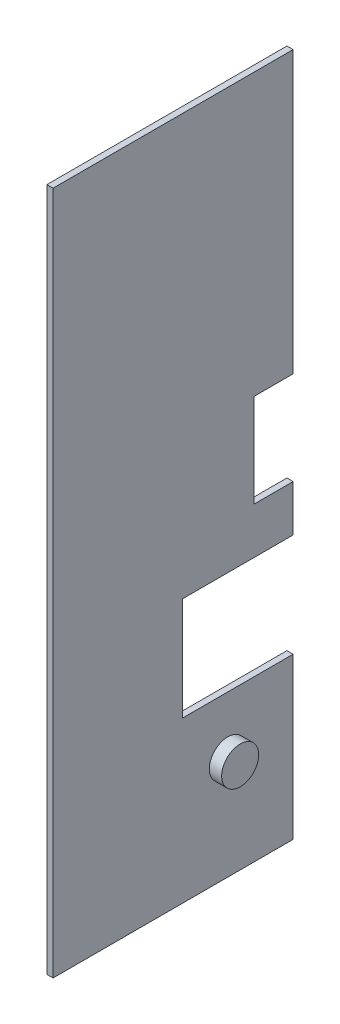
ISO-10303-21;
HEADER;
FILE_DESCRIPTION(('STEP AP214'),'2;1');
FILE_NAME('part.step','',(''),(''),'','','');
FILE_SCHEMA(('AUTOMOTIVE_DESIGN { 1 0 10303 214 1 1 1 1 }'));
ENDSEC;
DATA;
#1=APPLICATION_CONTEXT('core data for automotive mechanical design processes');
#2=APPLICATION_PROTOCOL_DEFINITION('international standard','automotive_design',2000,#1);
#3=PRODUCT_CONTEXT('',#1,'mechanical');
#4=PRODUCT('Part','Part','',(#3));
#5=PRODUCT_RELATED_PRODUCT_CATEGORY('part','',(#4));
#6=PRODUCT_DEFINITION_FORMATION('','',#4);
#7=PRODUCT_DEFINITION_CONTEXT('part definition',#1,'design');
#8=PRODUCT_DEFINITION('design','',#6,#7);
#9=PRODUCT_DEFINITION_SHAPE('','',#8);
#10=(LENGTH_UNIT() NAMED_UNIT(*) SI_UNIT(.MILLI.,.METRE.));
#11=(NAMED_UNIT(*) PLANE_ANGLE_UNIT() SI_UNIT($,.RADIAN.));
#12=(NAMED_UNIT(*) SI_UNIT($,.STERADIAN.) SOLID_ANGLE_UNIT());
#13=UNCERTAINTY_MEASURE_WITH_UNIT(LENGTH_MEASURE(1.E-05),#10,'distance_accuracy_value','');
#14=(GEOMETRIC_REPRESENTATION_CONTEXT(3) GLOBAL_UNCERTAINTY_ASSIGNED_CONTEXT((#13)) GLOBAL_UNIT_ASSIGNED_CONTEXT((#10,
#11,#12)) REPRESENTATION_CONTEXT('',''));
#15=CARTESIAN_POINT('',(0.,0.,0.));
#16=DIRECTION('',(0.,0.,1.));
#17=DIRECTION('',(1.,0.,0.));
#18=AXIS2_PLACEMENT_3D('',#15,#16,#17);
#19=CARTESIAN_POINT('',(1.,0.,0.));
#20=DIRECTION('',(-1.,0.,0.));
#21=DIRECTION('',(0.,0.,1.));
#22=AXIS2_PLACEMENT_3D('',#19,#20,#21);
#23=PLANE('',#22);
#24=CARTESIAN_POINT('',(1.,6.80563532490491,13.9678722965894));
#25=DIRECTION('',(-1.,0.,0.));
#26=DIRECTION('',(0.,0.,1.));
#27=AXIS2_PLACEMENT_3D('',#24,#25,#26);
#28=CIRCLE('',#27,1.37973862307829);
#29=CARTESIAN_POINT('',(1.,6.80563532490491,15.3476109196677));
#30=VERTEX_POINT('',#29);
#31=EDGE_CURVE('E138',#30,#30,#28,.T.);
#32=ORIENTED_EDGE('',*,*,#31,.T.);
#33=EDGE_LOOP('',(#32));
#34=FACE_BOUND('',#33,.T.);
#35=CARTESIAN_POINT('',(1.,6.80563532490491,13.9678722965894));
#36=DIRECTION('',(1.,0.,0.));
#37=DIRECTION('',(0.,0.,-1.));
#38=AXIS2_PLACEMENT_3D('',#35,#36,#37);
#39=CIRCLE('',#38,2.27350306586522);
#40=CARTESIAN_POINT('',(1.,6.80563532490491,11.6943692307242));
#41=VERTEX_POINT('',#40);
#42=EDGE_CURVE('E293',#41,#41,#39,.T.);
#43=ORIENTED_EDGE('',*,*,#42,.T.);
#44=EDGE_LOOP('',(#43));
#45=FACE_BOUND('',#44,.T.);
#46=ADVANCED_FACE('F32',(#34,#45),#23,.F.);
#47=CARTESIAN_POINT('',(1.,100.85,3.40000000000002));
#48=DIRECTION('',(0.,0.,-1.));
#49=DIRECTION('',(0.,1.,0.));
#50=AXIS2_PLACEMENT_3D('',#47,#48,#49);
#51=PLANE('',#50);
#52=DIRECTION('',(-1.,0.,0.));
#53=VECTOR('',#52,1.);
#54=CARTESIAN_POINT('',(3.,55.4012906469279,3.40000000000002));
#55=LINE('',#54,#53);
#56=CARTESIAN_POINT('',(1.,55.4012906469279,3.40000000000002));
#57=VERTEX_POINT('',#56);
#58=CARTESIAN_POINT('',(0.,55.4012906469279,3.40000000000002));
#59=VERTEX_POINT('',#58);
#60=EDGE_CURVE('E147',#57,#59,#55,.T.);
#61=ORIENTED_EDGE('',*,*,#60,.T.);
#62=DIRECTION('',(0.,-1.,0.));
#63=VECTOR('',#62,1.);
#64=CARTESIAN_POINT('',(0.,-9.84999999999989,3.40000000000002));
#65=LINE('',#64,#63);
#66=CARTESIAN_POINT('',(0.,100.85,3.40000000000002));
#67=VERTEX_POINT('',#66);
#68=EDGE_CURVE('E190',#67,#59,#65,.T.);
#69=ORIENTED_EDGE('',*,*,#68,.F.);
#70=DIRECTION('',(-1.,0.,0.));
#71=VECTOR('',#70,1.);
#72=CARTESIAN_POINT('',(1.,100.85,3.40000000000002));
#73=LINE('',#72,#71);
#74=CARTESIAN_POINT('',(1.,100.85,3.40000000000002));
#75=VERTEX_POINT('',#74);
#76=EDGE_CURVE('E213',#75,#67,#73,.T.);
#77=ORIENTED_EDGE('',*,*,#76,.F.);
#78=DIRECTION('',(0.,-1.,0.));
#79=VECTOR('',#78,1.);
#80=CARTESIAN_POINT('',(1.,100.85,3.40000000000002));
#81=LINE('',#80,#79);
#82=EDGE_CURVE('E206',#75,#57,#81,.T.);
#83=ORIENTED_EDGE('',*,*,#82,.T.);
#84=EDGE_LOOP('',(#61,#69,#77,#83));
#85=FACE_BOUND('',#84,.T.);
#86=ADVANCED_FACE('F231',(#85),#51,.T.);
#87=DIRECTION('',(-1.,0.,0.));
#88=VECTOR('',#87,1.);
#89=CARTESIAN_POINT('',(3.,40.3056784370558,3.40000000000002));
#90=LINE('',#89,#88);
#91=CARTESIAN_POINT('',(1.,40.3056784370558,3.40000000000002));
#92=VERTEX_POINT('',#91);
#93=CARTESIAN_POINT('',(0.,40.3056784370558,3.40000000000002));
#94=VERTEX_POINT('',#93);
#95=EDGE_CURVE('E47',#92,#94,#90,.T.);
#96=ORIENTED_EDGE('',*,*,#95,.F.);
#97=CARTESIAN_POINT('',(0.999999999999999,32.8158785874378,3.40000000000002));
#98=VERTEX_POINT('',#97);
#99=EDGE_CURVE('E210',#92,#98,#81,.T.);
#100=ORIENTED_EDGE('',*,*,#99,.T.);
#101=DIRECTION('',(-1.,0.,0.));
#102=VECTOR('',#101,1.);
#103=CARTESIAN_POINT('',(10.,32.8158785874378,3.40000000000002));
#104=LINE('',#103,#102);
#105=CARTESIAN_POINT('',(0.,32.8158785874378,3.40000000000002));
#106=VERTEX_POINT('',#105);
#107=EDGE_CURVE('E166',#98,#106,#104,.T.);
#108=ORIENTED_EDGE('',*,*,#107,.T.);
#109=EDGE_CURVE('E193',#94,#106,#65,.T.);
#110=ORIENTED_EDGE('',*,*,#109,.F.);
#111=EDGE_LOOP('',(#96,#100,#108,#110));
#112=FACE_BOUND('',#111,.T.);
#113=ADVANCED_FACE('F239',(#112),#51,.T.);
#114=CARTESIAN_POINT('',(1.,-9.84999999999989,3.40000000000003));
#115=DIRECTION('',(0.,-1.,0.));
#116=DIRECTION('',(0.,0.,-1.));
#117=AXIS2_PLACEMENT_3D('',#114,#115,#116);
#118=PLANE('',#117);
#119=DIRECTION('',(-1.,0.,0.));
#120=VECTOR('',#119,1.);
#121=CARTESIAN_POINT('',(1.,-9.84999999999989,42.25));
#122=LINE('',#121,#120);
#123=CARTESIAN_POINT('',(1.,-9.84999999999989,42.25));
#124=VERTEX_POINT('',#123);
#125=CARTESIAN_POINT('',(0.,-9.84999999999989,42.25));
#126=VERTEX_POINT('',#125);
#127=EDGE_CURVE('E209',#124,#126,#122,.T.);
#128=ORIENTED_EDGE('',*,*,#127,.T.);
#129=DIRECTION('',(0.,0.,1.));
#130=VECTOR('',#129,1.);
#131=CARTESIAN_POINT('',(0.,-9.84999999999989,42.25));
#132=LINE('',#131,#130);
#133=CARTESIAN_POINT('',(0.,-9.84999999999989,3.40000000000002));
#134=VERTEX_POINT('',#133);
#135=EDGE_CURVE('E192',#134,#126,#132,.T.);
#136=ORIENTED_EDGE('',*,*,#135,.F.);
#137=DIRECTION('',(-1.,0.,0.));
#138=VECTOR('',#137,1.);
#139=CARTESIAN_POINT('',(1.,-9.84999999999989,3.40000000000003));
#140=LINE('',#139,#138);
#141=CARTESIAN_POINT('',(1.,-9.84999999999989,3.40000000000003));
#142=VERTEX_POINT('',#141);
#143=EDGE_CURVE('E40',#142,#134,#140,.T.);
#144=ORIENTED_EDGE('',*,*,#143,.F.);
#145=DIRECTION('',(0.,0.,1.));
#146=VECTOR('',#145,1.);
#147=CARTESIAN_POINT('',(1.,-9.84999999999989,3.40000000000003));
#148=LINE('',#147,#146);
#149=EDGE_CURVE('E196',#142,#124,#148,.T.);
#150=ORIENTED_EDGE('',*,*,#149,.T.);
#151=EDGE_LOOP('',(#128,#136,#144,#150));
#152=FACE_BOUND('',#151,.T.);
#153=ADVANCED_FACE('F34',(#152),#118,.T.);
#154=DIRECTION('',(-1.,0.,0.));
#155=VECTOR('',#154,1.);
#156=CARTESIAN_POINT('',(10.,16.1071011738195,3.40000000000002));
#157=LINE('',#156,#155);
#158=CARTESIAN_POINT('',(0.999999999999999,16.1071011738195,3.40000000000002));
#159=VERTEX_POINT('',#158);
#160=CARTESIAN_POINT('',(0.,16.1071011738195,3.40000000000002));
#161=VERTEX_POINT('',#160);
#162=EDGE_CURVE('E55',#159,#161,#157,.T.);
#163=ORIENTED_EDGE('',*,*,#162,.F.);
#164=EDGE_CURVE('E205',#159,#142,#81,.T.);
#165=ORIENTED_EDGE('',*,*,#164,.T.);
#166=ORIENTED_EDGE('',*,*,#143,.T.);
#167=EDGE_CURVE('E189',#161,#134,#65,.T.);
#168=ORIENTED_EDGE('',*,*,#167,.F.);
#169=EDGE_LOOP('',(#163,#165,#166,#168));
#170=FACE_BOUND('',#169,.T.);
#171=ADVANCED_FACE('F250',(#170),#51,.T.);
#172=CARTESIAN_POINT('',(1.,100.85,42.25));
#173=DIRECTION('',(0.,1.,0.));
#174=DIRECTION('',(0.,0.,1.));
#175=AXIS2_PLACEMENT_3D('',#172,#173,#174);
#176=PLANE('',#175);
#177=ORIENTED_EDGE('',*,*,#76,.T.);
#178=DIRECTION('',(0.,0.,-1.));
#179=VECTOR('',#178,1.);
#180=CARTESIAN_POINT('',(0.,100.85,3.40000000000002));
#181=LINE('',#180,#179);
#182=CARTESIAN_POINT('',(0.,100.85,42.25));
#183=VERTEX_POINT('',#182);
#184=EDGE_CURVE('E186',#183,#67,#181,.T.);
#185=ORIENTED_EDGE('',*,*,#184,.F.);
#186=DIRECTION('',(-1.,0.,0.));
#187=VECTOR('',#186,1.);
#188=CARTESIAN_POINT('',(1.,100.85,42.25));
#189=LINE('',#188,#187);
#190=CARTESIAN_POINT('',(1.,100.85,42.25));
#191=VERTEX_POINT('',#190);
#192=EDGE_CURVE('E215',#191,#183,#189,.T.);
#193=ORIENTED_EDGE('',*,*,#192,.F.);
#194=DIRECTION('',(0.,0.,-1.));
#195=VECTOR('',#194,1.);
#196=CARTESIAN_POINT('',(1.,100.85,42.25));
#197=LINE('',#196,#195);
#198=EDGE_CURVE('E202',#191,#75,#197,.T.);
#199=ORIENTED_EDGE('',*,*,#198,.T.);
#200=EDGE_LOOP('',(#177,#185,#193,#199));
#201=FACE_BOUND('',#200,.T.);
#202=ADVANCED_FACE('F228',(#201),#176,.T.);
#203=CARTESIAN_POINT('',(1.,-9.84999999999989,42.25));
#204=DIRECTION('',(0.,0.,1.));
#205=DIRECTION('',(0.,-1.,0.));
#206=AXIS2_PLACEMENT_3D('',#203,#204,#205);
#207=PLANE('',#206);
#208=ORIENTED_EDGE('',*,*,#192,.T.);
#209=DIRECTION('',(0.,1.,0.));
#210=VECTOR('',#209,1.);
#211=CARTESIAN_POINT('',(0.,100.85,42.25));
#212=LINE('',#211,#210);
#213=EDGE_CURVE('E183',#126,#183,#212,.T.);
#214=ORIENTED_EDGE('',*,*,#213,.F.);
#215=ORIENTED_EDGE('',*,*,#127,.F.);
#216=DIRECTION('',(0.,1.,0.));
#217=VECTOR('',#216,1.);
#218=CARTESIAN_POINT('',(1.,-9.84999999999989,42.25));
#219=LINE('',#218,#217);
#220=EDGE_CURVE('E199',#124,#191,#219,.T.);
#221=ORIENTED_EDGE('',*,*,#220,.T.);
#222=EDGE_LOOP('',(#208,#214,#215,#221));
#223=FACE_BOUND('',#222,.T.);
#224=ADVANCED_FACE('F224',(#223),#207,.T.);
#225=CARTESIAN_POINT('',(1.,6.80563532490491,13.9678722965894));
#226=DIRECTION('',(-1.,0.,0.));
#227=DIRECTION('',(0.,0.,1.));
#228=AXIS2_PLACEMENT_3D('',#225,#226,#227);
#229=CIRCLE('',#228,3.00004301712036);
#230=CARTESIAN_POINT('',(1.,6.80563532490491,16.9679153137098));
#231=VERTEX_POINT('',#230);
#232=EDGE_CURVE('E11',#231,#231,#229,.F.);
#233=ORIENTED_EDGE('',*,*,#232,.F.);
#234=EDGE_LOOP('',(#233));
#235=FACE_BOUND('',#234,.T.);
#236=DIRECTION('',(0.,1.,0.));
#237=VECTOR('',#236,1.);
#238=CARTESIAN_POINT('',(1.,0.,9.73848540272368));
#239=LINE('',#238,#237);
#240=CARTESIAN_POINT('',(1.,40.3056784370558,9.73848540272368));
#241=VERTEX_POINT('',#240);
#242=CARTESIAN_POINT('',(1.,55.4012906469279,9.73848540272368));
#243=VERTEX_POINT('',#242);
#244=EDGE_CURVE('E130',#241,#243,#239,.T.);
#245=ORIENTED_EDGE('',*,*,#244,.T.);
#246=DIRECTION('',(0.,0.,-1.));
#247=VECTOR('',#246,1.);
#248=CARTESIAN_POINT('',(1.,55.4012906469279,0.));
#249=LINE('',#248,#247);
#250=EDGE_CURVE('E155',#243,#57,#249,.T.);
#251=ORIENTED_EDGE('',*,*,#250,.T.);
#252=ORIENTED_EDGE('',*,*,#82,.F.);
#253=ORIENTED_EDGE('',*,*,#198,.F.);
#254=ORIENTED_EDGE('',*,*,#220,.F.);
#255=ORIENTED_EDGE('',*,*,#149,.F.);
#256=ORIENTED_EDGE('',*,*,#164,.F.);
#257=DIRECTION('',(0.,0.,1.));
#258=VECTOR('',#257,1.);
#259=CARTESIAN_POINT('',(1.,16.1071011738195,0.));
#260=LINE('',#259,#258);
#261=CARTESIAN_POINT('',(0.999999999999999,16.1071011738195,21.3328270470195));
#262=VERTEX_POINT('',#261);
#263=EDGE_CURVE('E169',#159,#262,#260,.T.);
#264=ORIENTED_EDGE('',*,*,#263,.T.);
#265=DIRECTION('',(0.,1.,0.));
#266=VECTOR('',#265,1.);
#267=CARTESIAN_POINT('',(1.,0.,21.3328270470195));
#268=LINE('',#267,#266);
#269=CARTESIAN_POINT('',(0.999999999999999,32.8158785874378,21.3328270470195));
#270=VERTEX_POINT('',#269);
#271=EDGE_CURVE('E177',#262,#270,#268,.T.);
#272=ORIENTED_EDGE('',*,*,#271,.T.);
#273=DIRECTION('',(0.,0.,-1.));
#274=VECTOR('',#273,1.);
#275=CARTESIAN_POINT('',(1.,32.8158785874378,0.));
#276=LINE('',#275,#274);
#277=EDGE_CURVE('E180',#270,#98,#276,.T.);
#278=ORIENTED_EDGE('',*,*,#277,.T.);
#279=ORIENTED_EDGE('',*,*,#99,.F.);
#280=DIRECTION('',(0.,0.,1.));
#281=VECTOR('',#280,1.);
#282=CARTESIAN_POINT('',(1.,40.3056784370558,0.));
#283=LINE('',#282,#281);
#284=EDGE_CURVE('E150',#92,#241,#283,.T.);
#285=ORIENTED_EDGE('',*,*,#284,.T.);
#286=EDGE_LOOP('',(#245,#251,#252,#253,#254,#255,#256,#264,#272,#278,#279,#285));
#287=FACE_BOUND('',#286,.T.);
#288=ADVANCED_FACE('F236',(#235,#287),#23,.F.);
#289=CARTESIAN_POINT('',(0.,0.,0.));
#290=DIRECTION('',(1.,0.,0.));
#291=DIRECTION('',(0.,0.,-1.));
#292=AXIS2_PLACEMENT_3D('',#289,#290,#291);
#293=PLANE('',#292);
#294=CARTESIAN_POINT('',(0.,6.80563532490491,13.9678722965894));
#295=DIRECTION('',(-1.,0.,0.));
#296=DIRECTION('',(0.,0.,1.));
#297=AXIS2_PLACEMENT_3D('',#294,#295,#296);
#298=CIRCLE('',#297,1.37973862307829);
#299=CARTESIAN_POINT('',(0.,6.80563532490491,15.3476109196677));
#300=VERTEX_POINT('',#299);
#301=EDGE_CURVE('E298',#300,#300,#298,.T.);
#302=ORIENTED_EDGE('',*,*,#301,.F.);
#303=EDGE_LOOP('',(#302));
#304=FACE_BOUND('',#303,.T.);
#305=ORIENTED_EDGE('',*,*,#68,.T.);
#306=DIRECTION('',(0.,0.,-1.));
#307=VECTOR('',#306,1.);
#308=CARTESIAN_POINT('',(0.,55.4012906469279,3.40000000000002));
#309=LINE('',#308,#307);
#310=CARTESIAN_POINT('',(0.,55.4012906469279,9.73848540272368));
#311=VERTEX_POINT('',#310);
#312=EDGE_CURVE('E142',#311,#59,#309,.T.);
#313=ORIENTED_EDGE('',*,*,#312,.F.);
#314=DIRECTION('',(0.,1.,0.));
#315=VECTOR('',#314,1.);
#316=CARTESIAN_POINT('',(0.,55.4012906469279,9.73848540272368));
#317=LINE('',#316,#315);
#318=CARTESIAN_POINT('',(0.,40.3056784370558,9.73848540272368));
#319=VERTEX_POINT('',#318);
#320=EDGE_CURVE('E127',#319,#311,#317,.T.);
#321=ORIENTED_EDGE('',*,*,#320,.F.);
#322=DIRECTION('',(0.,0.,1.));
#323=VECTOR('',#322,1.);
#324=CARTESIAN_POINT('',(0.,40.3056784370558,3.40000000000002));
#325=LINE('',#324,#323);
#326=EDGE_CURVE('E134',#94,#319,#325,.T.);
#327=ORIENTED_EDGE('',*,*,#326,.F.);
#328=ORIENTED_EDGE('',*,*,#109,.T.);
#329=DIRECTION('',(0.,0.,-1.));
#330=VECTOR('',#329,1.);
#331=CARTESIAN_POINT('',(0.,32.8158785874378,3.40000000000002));
#332=LINE('',#331,#330);
#333=CARTESIAN_POINT('',(0.,32.8158785874378,21.3328270470195));
#334=VERTEX_POINT('',#333);
#335=EDGE_CURVE('E163',#334,#106,#332,.T.);
#336=ORIENTED_EDGE('',*,*,#335,.F.);
#337=DIRECTION('',(0.,1.,0.));
#338=VECTOR('',#337,1.);
#339=CARTESIAN_POINT('',(0.,32.8158785874378,21.3328270470195));
#340=LINE('',#339,#338);
#341=CARTESIAN_POINT('',(0.,16.1071011738195,21.3328270470195));
#342=VERTEX_POINT('',#341);
#343=EDGE_CURVE('E160',#342,#334,#340,.T.);
#344=ORIENTED_EDGE('',*,*,#343,.F.);
#345=DIRECTION('',(0.,0.,1.));
#346=VECTOR('',#345,1.);
#347=CARTESIAN_POINT('',(0.,16.1071011738195,3.40000000000002));
#348=LINE('',#347,#346);
#349=EDGE_CURVE('E158',#161,#342,#348,.T.);
#350=ORIENTED_EDGE('',*,*,#349,.F.);
#351=ORIENTED_EDGE('',*,*,#167,.T.);
#352=ORIENTED_EDGE('',*,*,#135,.T.);
#353=ORIENTED_EDGE('',*,*,#213,.T.);
#354=ORIENTED_EDGE('',*,*,#184,.T.);
#355=EDGE_LOOP('',(#305,#313,#321,#327,#328,#336,#344,#350,#351,#352,#353,#354));
#356=FACE_BOUND('',#355,.T.);
#357=ADVANCED_FACE('F141',(#304,#356),#293,.F.);
#358=CARTESIAN_POINT('',(10.,32.8158785874378,3.40000000000002));
#359=DIRECTION('',(0.,1.,0.));
#360=DIRECTION('',(0.,0.,1.));
#361=AXIS2_PLACEMENT_3D('',#358,#359,#360);
#362=PLANE('',#361);
#363=DIRECTION('',(-1.,0.,0.));
#364=VECTOR('',#363,1.);
#365=CARTESIAN_POINT('',(10.,32.8158785874378,21.3328270470195));
#366=LINE('',#365,#364);
#367=EDGE_CURVE('E170',#270,#334,#366,.T.);
#368=ORIENTED_EDGE('',*,*,#367,.T.);
#369=ORIENTED_EDGE('',*,*,#335,.T.);
#370=ORIENTED_EDGE('',*,*,#107,.F.);
#371=ORIENTED_EDGE('',*,*,#277,.F.);
#372=EDGE_LOOP('',(#368,#369,#370,#371));
#373=FACE_BOUND('',#372,.T.);
#374=ADVANCED_FACE('F244',(#373),#362,.F.);
#375=CARTESIAN_POINT('',(10.,32.8158785874378,21.3328270470195));
#376=DIRECTION('',(0.,0.,1.));
#377=DIRECTION('',(0.,-1.,0.));
#378=AXIS2_PLACEMENT_3D('',#375,#376,#377);
#379=PLANE('',#378);
#380=DIRECTION('',(-1.,0.,0.));
#381=VECTOR('',#380,1.);
#382=CARTESIAN_POINT('',(10.,16.1071011738195,21.3328270470195));
#383=LINE('',#382,#381);
#384=EDGE_CURVE('E172',#262,#342,#383,.T.);
#385=ORIENTED_EDGE('',*,*,#384,.T.);
#386=ORIENTED_EDGE('',*,*,#343,.T.);
#387=ORIENTED_EDGE('',*,*,#367,.F.);
#388=ORIENTED_EDGE('',*,*,#271,.F.);
#389=EDGE_LOOP('',(#385,#386,#387,#388));
#390=FACE_BOUND('',#389,.T.);
#391=ADVANCED_FACE('F247',(#390),#379,.F.);
#392=CARTESIAN_POINT('',(10.,16.1071011738195,3.40000000000002));
#393=DIRECTION('',(0.,-1.,0.));
#394=DIRECTION('',(0.,0.,-1.));
#395=AXIS2_PLACEMENT_3D('',#392,#393,#394);
#396=PLANE('',#395);
#397=ORIENTED_EDGE('',*,*,#162,.T.);
#398=ORIENTED_EDGE('',*,*,#349,.T.);
#399=ORIENTED_EDGE('',*,*,#384,.F.);
#400=ORIENTED_EDGE('',*,*,#263,.F.);
#401=EDGE_LOOP('',(#397,#398,#399,#400));
#402=FACE_BOUND('',#401,.T.);
#403=ADVANCED_FACE('F252',(#402),#396,.F.);
#404=CARTESIAN_POINT('',(3.,55.4012906469279,3.40000000000002));
#405=DIRECTION('',(0.,1.,0.));
#406=DIRECTION('',(0.,0.,1.));
#407=AXIS2_PLACEMENT_3D('',#404,#405,#406);
#408=PLANE('',#407);
#409=DIRECTION('',(-1.,0.,0.));
#410=VECTOR('',#409,1.);
#411=CARTESIAN_POINT('',(3.,55.4012906469279,9.73848540272368));
#412=LINE('',#411,#410);
#413=EDGE_CURVE('E132',#243,#311,#412,.T.);
#414=ORIENTED_EDGE('',*,*,#413,.T.);
#415=ORIENTED_EDGE('',*,*,#312,.T.);
#416=ORIENTED_EDGE('',*,*,#60,.F.);
#417=ORIENTED_EDGE('',*,*,#250,.F.);
#418=EDGE_LOOP('',(#414,#415,#416,#417));
#419=FACE_BOUND('',#418,.T.);
#420=ADVANCED_FACE('F234',(#419),#408,.F.);
#421=CARTESIAN_POINT('',(3.,55.4012906469279,9.73848540272368));
#422=DIRECTION('',(0.,0.,1.));
#423=DIRECTION('',(1.,0.,0.));
#424=AXIS2_PLACEMENT_3D('',#421,#422,#423);
#425=PLANE('',#424);
#426=DIRECTION('',(-1.,0.,0.));
#427=VECTOR('',#426,1.);
#428=CARTESIAN_POINT('',(3.,40.3056784370558,9.73848540272368));
#429=LINE('',#428,#427);
#430=EDGE_CURVE('E123',#241,#319,#429,.T.);
#431=ORIENTED_EDGE('',*,*,#430,.T.);
#432=ORIENTED_EDGE('',*,*,#320,.T.);
#433=ORIENTED_EDGE('',*,*,#413,.F.);
#434=ORIENTED_EDGE('',*,*,#244,.F.);
#435=EDGE_LOOP('',(#431,#432,#433,#434));
#436=FACE_BOUND('',#435,.T.);
#437=ADVANCED_FACE('F124',(#436),#425,.F.);
#438=CARTESIAN_POINT('',(3.,40.3056784370558,3.40000000000002));
#439=DIRECTION('',(0.,-1.,0.));
#440=DIRECTION('',(0.,0.,-1.));
#441=AXIS2_PLACEMENT_3D('',#438,#439,#440);
#442=PLANE('',#441);
#443=ORIENTED_EDGE('',*,*,#95,.T.);
#444=ORIENTED_EDGE('',*,*,#326,.T.);
#445=ORIENTED_EDGE('',*,*,#430,.F.);
#446=ORIENTED_EDGE('',*,*,#284,.F.);
#447=EDGE_LOOP('',(#443,#444,#445,#446));
#448=FACE_BOUND('',#447,.T.);
#449=ADVANCED_FACE('F135',(#448),#442,.F.);
#450=CARTESIAN_POINT('',(3.,6.80563532490491,13.9678722965894));
#451=DIRECTION('',(-1.,0.,0.));
#452=DIRECTION('',(0.,0.,1.));
#453=AXIS2_PLACEMENT_3D('',#450,#451,#452);
#454=CYLINDRICAL_SURFACE('',#453,1.37973862307829);
#455=ORIENTED_EDGE('',*,*,#301,.T.);
#456=EDGE_LOOP('',(#455));
#457=FACE_BOUND('',#456,.T.);
#458=ORIENTED_EDGE('',*,*,#31,.F.);
#459=EDGE_LOOP('',(#458));
#460=FACE_BOUND('',#459,.T.);
#461=ADVANCED_FACE('F284',(#457,#460),#454,.F.);
#462=CARTESIAN_POINT('',(2.,6.80563532490491,13.9678722965894));
#463=DIRECTION('',(-1.,0.,0.));
#464=DIRECTION('',(0.,0.,1.));
#465=AXIS2_PLACEMENT_3D('',#462,#463,#464);
#466=CYLINDRICAL_SURFACE('',#465,3.00004301712036);
#467=ORIENTED_EDGE('',*,*,#232,.T.);
#468=EDGE_LOOP('',(#467));
#469=FACE_BOUND('',#468,.T.);
#470=CARTESIAN_POINT('',(3.,6.80563532490491,13.9678722965894));
#471=DIRECTION('',(1.,0.,0.));
#472=DIRECTION('',(0.,0.,-1.));
#473=AXIS2_PLACEMENT_3D('',#470,#471,#472);
#474=CIRCLE('',#473,3.00004301712036);
#475=CARTESIAN_POINT('',(3.,6.80563532490491,10.9678292794691));
#476=VERTEX_POINT('',#475);
#477=EDGE_CURVE('E288',#476,#476,#474,.T.);
#478=ORIENTED_EDGE('',*,*,#477,.F.);
#479=EDGE_LOOP('',(#478));
#480=FACE_BOUND('',#479,.T.);
#481=ADVANCED_FACE('F280',(#469,#480),#466,.T.);
#482=CARTESIAN_POINT('',(2.,6.80563532490491,13.9678722965894));
#483=DIRECTION('',(-1.,0.,0.));
#484=DIRECTION('',(0.,0.,1.));
#485=AXIS2_PLACEMENT_3D('',#482,#483,#484);
#486=CYLINDRICAL_SURFACE('',#485,2.27350306586522);
#487=CARTESIAN_POINT('',(2.,6.80563532490491,13.9678722965894));
#488=DIRECTION('',(1.,0.,0.));
#489=DIRECTION('',(0.,0.,-1.));
#490=AXIS2_PLACEMENT_3D('',#487,#488,#489);
#491=CIRCLE('',#490,2.27350306586522);
#492=CARTESIAN_POINT('',(2.,6.80563532490491,11.6943692307242));
#493=VERTEX_POINT('',#492);
#494=EDGE_CURVE('E290',#493,#493,#491,.T.);
#495=ORIENTED_EDGE('',*,*,#494,.T.);
#496=EDGE_LOOP('',(#495));
#497=FACE_BOUND('',#496,.T.);
#498=ORIENTED_EDGE('',*,*,#42,.F.);
#499=EDGE_LOOP('',(#498));
#500=FACE_BOUND('',#499,.T.);
#501=ADVANCED_FACE('F283',(#497,#500),#486,.F.);
#502=CARTESIAN_POINT('',(2.,6.80563532490491,13.9678722965894));
#503=DIRECTION('',(1.,0.,0.));
#504=DIRECTION('',(0.,0.,-1.));
#505=AXIS2_PLACEMENT_3D('',#502,#503,#504);
#506=PLANE('',#505);
#507=ORIENTED_EDGE('',*,*,#494,.F.);
#508=EDGE_LOOP('',(#507));
#509=FACE_BOUND('',#508,.T.);
#510=ADVANCED_FACE('F390',(#509),#506,.F.);
#511=CARTESIAN_POINT('',(3.,6.80563532490491,13.9678722965894));
#512=DIRECTION('',(1.,0.,0.));
#513=DIRECTION('',(0.,0.,-1.));
#514=AXIS2_PLACEMENT_3D('',#511,#512,#513);
#515=PLANE('',#514);
#516=ORIENTED_EDGE('',*,*,#477,.T.);
#517=EDGE_LOOP('',(#516));
#518=FACE_BOUND('',#517,.T.);
#519=ADVANCED_FACE('F405',(#518),#515,.T.);
#520=CLOSED_SHELL('',(#46,#86,#113,#153,#171,#202,#224,#288,#357,#374,#391,#403,#420,#437,#449,
#461,#481,#501,#510,#519));
#521=MANIFOLD_SOLID_BREP('B2',#520);
#522=ADVANCED_BREP_SHAPE_REPRESENTATION('',(#18,#521),#14);
#523=SHAPE_DEFINITION_REPRESENTATION(#9,#522);
ENDSEC;
END-ISO-10303-21;
